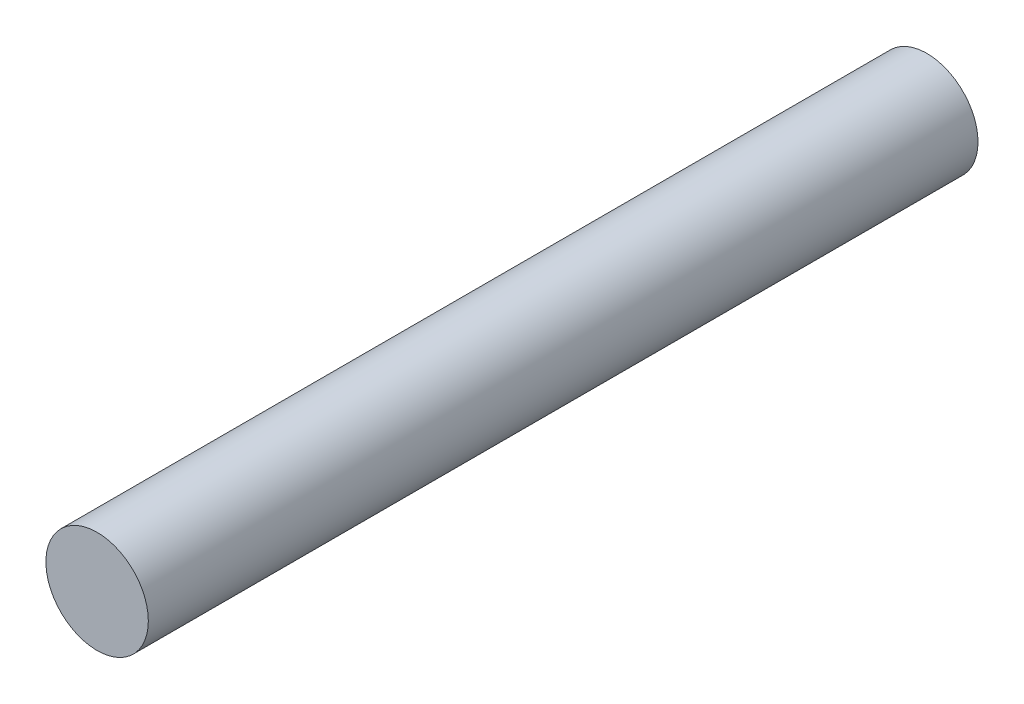
ISO-10303-21;
HEADER;
FILE_DESCRIPTION(('STEP AP214'),'2;1');
FILE_NAME('part.step','',(''),(''),'','','');
FILE_SCHEMA(('AUTOMOTIVE_DESIGN { 1 0 10303 214 1 1 1 1 }'));
ENDSEC;
DATA;
#1=APPLICATION_CONTEXT('core data for automotive mechanical design processes');
#2=APPLICATION_PROTOCOL_DEFINITION('international standard','automotive_design',2000,#1);
#3=PRODUCT_CONTEXT('',#1,'mechanical');
#4=PRODUCT('Part','Part','',(#3));
#5=PRODUCT_RELATED_PRODUCT_CATEGORY('part','',(#4));
#6=PRODUCT_DEFINITION_FORMATION('','',#4);
#7=PRODUCT_DEFINITION_CONTEXT('part definition',#1,'design');
#8=PRODUCT_DEFINITION('design','',#6,#7);
#9=PRODUCT_DEFINITION_SHAPE('','',#8);
#10=(LENGTH_UNIT() NAMED_UNIT(*) SI_UNIT(.MILLI.,.METRE.));
#11=(NAMED_UNIT(*) PLANE_ANGLE_UNIT() SI_UNIT($,.RADIAN.));
#12=(NAMED_UNIT(*) SI_UNIT($,.STERADIAN.) SOLID_ANGLE_UNIT());
#13=UNCERTAINTY_MEASURE_WITH_UNIT(LENGTH_MEASURE(1.E-05),#10,'distance_accuracy_value','');
#14=(GEOMETRIC_REPRESENTATION_CONTEXT(3) GLOBAL_UNCERTAINTY_ASSIGNED_CONTEXT((#13)) GLOBAL_UNIT_ASSIGNED_CONTEXT((#10,
#11,#12)) REPRESENTATION_CONTEXT('',''));
#15=CARTESIAN_POINT('',(0.,0.,0.));
#16=DIRECTION('',(0.,0.,1.));
#17=DIRECTION('',(1.,0.,0.));
#18=AXIS2_PLACEMENT_3D('',#15,#16,#17);
#19=CARTESIAN_POINT('',(0.,0.,16.2));
#20=DIRECTION('',(0.,0.,-1.));
#21=DIRECTION('',(-1.,0.,0.));
#22=AXIS2_PLACEMENT_3D('',#19,#20,#21);
#23=CYLINDRICAL_SURFACE('',#22,1.);
#24=CARTESIAN_POINT('',(0.,0.,16.2));
#25=DIRECTION('',(0.,0.,1.));
#26=DIRECTION('',(1.,0.,0.));
#27=AXIS2_PLACEMENT_3D('',#24,#25,#26);
#28=CIRCLE('',#27,1.);
#29=CARTESIAN_POINT('',(1.,0.,16.2));
#30=VERTEX_POINT('',#29);
#31=EDGE_CURVE('E10',#30,#30,#28,.T.);
#32=ORIENTED_EDGE('',*,*,#31,.F.);
#33=EDGE_LOOP('',(#32));
#34=FACE_BOUND('',#33,.T.);
#35=CARTESIAN_POINT('',(0.,0.,0.));
#36=DIRECTION('',(0.,0.,1.));
#37=DIRECTION('',(1.,0.,0.));
#38=AXIS2_PLACEMENT_3D('',#35,#36,#37);
#39=CIRCLE('',#38,1.);
#40=CARTESIAN_POINT('',(1.,0.,0.));
#41=VERTEX_POINT('',#40);
#42=EDGE_CURVE('E42',#41,#41,#39,.T.);
#43=ORIENTED_EDGE('',*,*,#42,.T.);
#44=EDGE_LOOP('',(#43));
#45=FACE_BOUND('',#44,.T.);
#46=ADVANCED_FACE('F39',(#34,#45),#23,.T.);
#47=CARTESIAN_POINT('',(0.,0.,16.2));
#48=DIRECTION('',(0.,0.,1.));
#49=DIRECTION('',(1.,0.,0.));
#50=AXIS2_PLACEMENT_3D('',#47,#48,#49);
#51=PLANE('',#50);
#52=ORIENTED_EDGE('',*,*,#31,.T.);
#53=EDGE_LOOP('',(#52));
#54=FACE_BOUND('',#53,.T.);
#55=ADVANCED_FACE('F54',(#54),#51,.T.);
#56=CARTESIAN_POINT('',(0.,0.,0.));
#57=DIRECTION('',(0.,0.,1.));
#58=DIRECTION('',(1.,0.,0.));
#59=AXIS2_PLACEMENT_3D('',#56,#57,#58);
#60=PLANE('',#59);
#61=ORIENTED_EDGE('',*,*,#42,.F.);
#62=EDGE_LOOP('',(#61));
#63=FACE_BOUND('',#62,.T.);
#64=ADVANCED_FACE('F52',(#63),#60,.F.);
#65=CLOSED_SHELL('',(#46,#55,#64));
#66=MANIFOLD_SOLID_BREP('B2',#65);
#67=ADVANCED_BREP_SHAPE_REPRESENTATION('',(#18,#66),#14);
#68=SHAPE_DEFINITION_REPRESENTATION(#9,#67);
ENDSEC;
END-ISO-10303-21;
